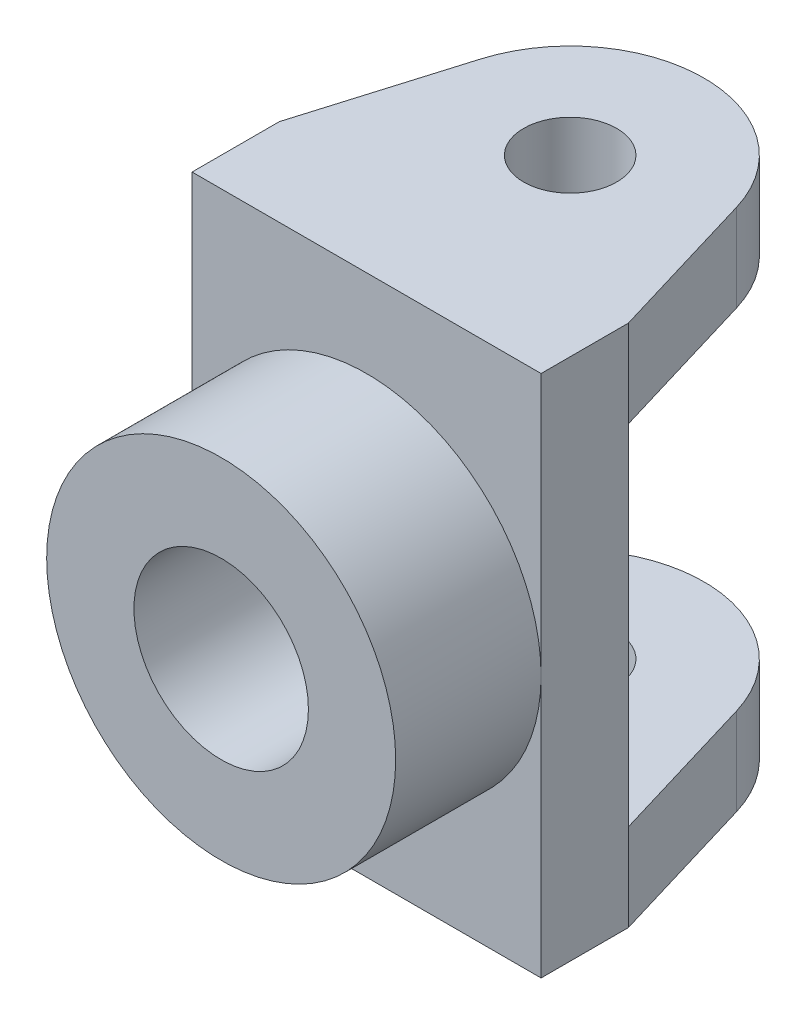
ISO-10303-21;
HEADER;
FILE_DESCRIPTION(('STEP AP214'),'2;1');
FILE_NAME('part.step','',(''),(''),'','','');
FILE_SCHEMA(('AUTOMOTIVE_DESIGN { 1 0 10303 214 1 1 1 1 }'));
ENDSEC;
DATA;
#1=APPLICATION_CONTEXT('core data for automotive mechanical design processes');
#2=APPLICATION_PROTOCOL_DEFINITION('international standard','automotive_design',2000,#1);
#3=PRODUCT_CONTEXT('',#1,'mechanical');
#4=PRODUCT('Part','Part','',(#3));
#5=PRODUCT_RELATED_PRODUCT_CATEGORY('part','',(#4));
#6=PRODUCT_DEFINITION_FORMATION('','',#4);
#7=PRODUCT_DEFINITION_CONTEXT('part definition',#1,'design');
#8=PRODUCT_DEFINITION('design','',#6,#7);
#9=PRODUCT_DEFINITION_SHAPE('','',#8);
#10=(LENGTH_UNIT() NAMED_UNIT(*) SI_UNIT(.MILLI.,.METRE.));
#11=(NAMED_UNIT(*) PLANE_ANGLE_UNIT() SI_UNIT($,.RADIAN.));
#12=(NAMED_UNIT(*) SI_UNIT($,.STERADIAN.) SOLID_ANGLE_UNIT());
#13=UNCERTAINTY_MEASURE_WITH_UNIT(LENGTH_MEASURE(1.E-05),#10,'distance_accuracy_value','');
#14=(GEOMETRIC_REPRESENTATION_CONTEXT(3) GLOBAL_UNCERTAINTY_ASSIGNED_CONTEXT((#13)) GLOBAL_UNIT_ASSIGNED_CONTEXT((#10,
#11,#12)) REPRESENTATION_CONTEXT('',''));
#15=CARTESIAN_POINT('',(0.,0.,0.));
#16=DIRECTION('',(0.,0.,1.));
#17=DIRECTION('',(1.,0.,0.));
#18=AXIS2_PLACEMENT_3D('',#15,#16,#17);
#19=CARTESIAN_POINT('',(0.,0.,0.));
#20=DIRECTION('',(0.,0.,1.));
#21=DIRECTION('',(1.,0.,0.));
#22=AXIS2_PLACEMENT_3D('',#19,#20,#21);
#23=PLANE('',#22);
#24=DIRECTION('',(1.,0.,0.));
#25=VECTOR('',#24,1.);
#26=CARTESIAN_POINT('',(-30.,-30.,0.));
#27=LINE('',#26,#25);
#28=CARTESIAN_POINT('',(-30.,-30.,0.));
#29=VERTEX_POINT('',#28);
#30=CARTESIAN_POINT('',(30.,-30.,0.));
#31=VERTEX_POINT('',#30);
#32=EDGE_CURVE('E123',#29,#31,#27,.T.);
#33=ORIENTED_EDGE('',*,*,#32,.F.);
#34=DIRECTION('',(0.,-1.,0.));
#35=VECTOR('',#34,1.);
#36=CARTESIAN_POINT('',(-30.,-45.,0.));
#37=LINE('',#36,#35);
#38=CARTESIAN_POINT('',(-30.,30.,0.));
#39=VERTEX_POINT('',#38);
#40=EDGE_CURVE('E145',#39,#29,#37,.T.);
#41=ORIENTED_EDGE('',*,*,#40,.F.);
#42=DIRECTION('',(1.,0.,0.));
#43=VECTOR('',#42,1.);
#44=CARTESIAN_POINT('',(-30.,30.,0.));
#45=LINE('',#44,#43);
#46=CARTESIAN_POINT('',(30.,30.,0.));
#47=VERTEX_POINT('',#46);
#48=EDGE_CURVE('E212',#39,#47,#45,.T.);
#49=ORIENTED_EDGE('',*,*,#48,.T.);
#50=DIRECTION('',(0.,1.,0.));
#51=VECTOR('',#50,1.);
#52=CARTESIAN_POINT('',(30.,-45.,0.));
#53=LINE('',#52,#51);
#54=EDGE_CURVE('E50',#31,#47,#53,.T.);
#55=ORIENTED_EDGE('',*,*,#54,.F.);
#56=EDGE_LOOP('',(#33,#41,#49,#55));
#57=FACE_BOUND('',#56,.T.);
#58=ADVANCED_FACE('F33',(#57),#23,.F.);
#59=CARTESIAN_POINT('',(0.,0.,15.));
#60=DIRECTION('',(0.,0.,1.));
#61=DIRECTION('',(1.,0.,0.));
#62=AXIS2_PLACEMENT_3D('',#59,#60,#61);
#63=PLANE('',#62);
#64=CARTESIAN_POINT('',(0.,0.,15.));
#65=DIRECTION('',(0.,0.,1.));
#66=DIRECTION('',(1.,0.,0.));
#67=AXIS2_PLACEMENT_3D('',#64,#65,#66);
#68=CIRCLE('',#67,30.);
#69=CARTESIAN_POINT('',(30.,0.,15.));
#70=VERTEX_POINT('',#69);
#71=CARTESIAN_POINT('',(-30.,0.,15.));
#72=VERTEX_POINT('',#71);
#73=EDGE_CURVE('E43',#70,#72,#68,.T.);
#74=ORIENTED_EDGE('',*,*,#73,.F.);
#75=DIRECTION('',(0.,1.,0.));
#76=VECTOR('',#75,1.);
#77=CARTESIAN_POINT('',(30.,-45.,15.));
#78=LINE('',#77,#76);
#79=CARTESIAN_POINT('',(30.,45.,15.));
#80=VERTEX_POINT('',#79);
#81=EDGE_CURVE('E194',#70,#80,#78,.T.);
#82=ORIENTED_EDGE('',*,*,#81,.T.);
#83=DIRECTION('',(-1.,0.,0.));
#84=VECTOR('',#83,1.);
#85=CARTESIAN_POINT('',(30.,45.,15.));
#86=LINE('',#85,#84);
#87=CARTESIAN_POINT('',(-30.,45.,15.));
#88=VERTEX_POINT('',#87);
#89=EDGE_CURVE('E157',#80,#88,#86,.T.);
#90=ORIENTED_EDGE('',*,*,#89,.T.);
#91=DIRECTION('',(0.,-1.,0.));
#92=VECTOR('',#91,1.);
#93=CARTESIAN_POINT('',(-30.,-45.,15.));
#94=LINE('',#93,#92);
#95=EDGE_CURVE('E178',#88,#72,#94,.T.);
#96=ORIENTED_EDGE('',*,*,#95,.T.);
#97=EDGE_LOOP('',(#74,#82,#90,#96));
#98=FACE_BOUND('',#97,.T.);
#99=ADVANCED_FACE('F183',(#98),#63,.T.);
#100=CARTESIAN_POINT('',(-30.,-45.,15.));
#101=DIRECTION('',(1.,0.,0.));
#102=DIRECTION('',(0.,0.,-1.));
#103=AXIS2_PLACEMENT_3D('',#100,#101,#102);
#104=PLANE('',#103);
#105=CARTESIAN_POINT('',(-30.,45.,0.));
#106=VERTEX_POINT('',#105);
#107=EDGE_CURVE('E150',#106,#39,#37,.T.);
#108=ORIENTED_EDGE('',*,*,#107,.T.);
#109=ORIENTED_EDGE('',*,*,#40,.T.);
#110=DIRECTION('',(0.,-1.,0.));
#111=VECTOR('',#110,1.);
#112=CARTESIAN_POINT('',(-30.,-30.,0.));
#113=LINE('',#112,#111);
#114=CARTESIAN_POINT('',(-30.,-45.,0.));
#115=VERTEX_POINT('',#114);
#116=EDGE_CURVE('E131',#29,#115,#113,.T.);
#117=ORIENTED_EDGE('',*,*,#116,.T.);
#118=DIRECTION('',(0.,0.,-1.));
#119=VECTOR('',#118,1.);
#120=CARTESIAN_POINT('',(-30.,-45.,15.));
#121=LINE('',#120,#119);
#122=CARTESIAN_POINT('',(-30.,-45.,15.));
#123=VERTEX_POINT('',#122);
#124=EDGE_CURVE('E37',#123,#115,#121,.T.);
#125=ORIENTED_EDGE('',*,*,#124,.F.);
#126=EDGE_CURVE('E161',#72,#123,#94,.T.);
#127=ORIENTED_EDGE('',*,*,#126,.F.);
#128=ORIENTED_EDGE('',*,*,#95,.F.);
#129=DIRECTION('',(0.,0.,-1.));
#130=VECTOR('',#129,1.);
#131=CARTESIAN_POINT('',(-30.,45.,15.));
#132=LINE('',#131,#130);
#133=EDGE_CURVE('E162',#88,#106,#132,.T.);
#134=ORIENTED_EDGE('',*,*,#133,.T.);
#135=EDGE_LOOP('',(#108,#109,#117,#125,#127,#128,#134));
#136=FACE_BOUND('',#135,.T.);
#137=ADVANCED_FACE('F35',(#136),#104,.F.);
#138=CARTESIAN_POINT('',(30.,-45.,15.));
#139=DIRECTION('',(0.,1.,0.));
#140=DIRECTION('',(-1.,0.,0.));
#141=AXIS2_PLACEMENT_3D('',#138,#139,#140);
#142=PLANE('',#141);
#143=ORIENTED_EDGE('',*,*,#124,.T.);
#144=DIRECTION('',(-0.286928155857607,0.,0.957952103905072));
#145=VECTOR('',#144,1.);
#146=CARTESIAN_POINT('',(-30.,-45.,0.));
#147=LINE('',#146,#145);
#148=CARTESIAN_POINT('',(-22.0328983898167,-45.,-26.599347584725));
#149=VERTEX_POINT('',#148);
#150=EDGE_CURVE('E134',#149,#115,#147,.T.);
#151=ORIENTED_EDGE('',*,*,#150,.F.);
#152=CARTESIAN_POINT('',(0.,-45.,-20.));
#153=DIRECTION('',(0.,1.,0.));
#154=DIRECTION('',(-1.,0.,0.));
#155=AXIS2_PLACEMENT_3D('',#152,#153,#154);
#156=CIRCLE('',#155,23.);
#157=CARTESIAN_POINT('',(22.0328983898166,-45.,-26.599347584725));
#158=VERTEX_POINT('',#157);
#159=EDGE_CURVE('E429',#158,#149,#156,.T.);
#160=ORIENTED_EDGE('',*,*,#159,.F.);
#161=DIRECTION('',(-0.286928155857607,0.,-0.957952103905071));
#162=VECTOR('',#161,1.);
#163=CARTESIAN_POINT('',(30.,-45.,0.));
#164=LINE('',#163,#162);
#165=CARTESIAN_POINT('',(30.,-45.,0.));
#166=VERTEX_POINT('',#165);
#167=EDGE_CURVE('E147',#166,#158,#164,.T.);
#168=ORIENTED_EDGE('',*,*,#167,.F.);
#169=DIRECTION('',(0.,0.,-1.));
#170=VECTOR('',#169,1.);
#171=CARTESIAN_POINT('',(30.,-45.,15.));
#172=LINE('',#171,#170);
#173=CARTESIAN_POINT('',(30.,-45.,15.));
#174=VERTEX_POINT('',#173);
#175=EDGE_CURVE('E166',#174,#166,#172,.T.);
#176=ORIENTED_EDGE('',*,*,#175,.F.);
#177=DIRECTION('',(1.,0.,0.));
#178=VECTOR('',#177,1.);
#179=CARTESIAN_POINT('',(30.,-45.,15.));
#180=LINE('',#179,#178);
#181=EDGE_CURVE('E175',#123,#174,#180,.T.);
#182=ORIENTED_EDGE('',*,*,#181,.F.);
#183=EDGE_LOOP('',(#143,#151,#160,#168,#176,#182));
#184=FACE_BOUND('',#183,.T.);
#185=CARTESIAN_POINT('',(0.,-45.,-20.));
#186=DIRECTION('',(0.,1.,0.));
#187=DIRECTION('',(-1.,0.,0.));
#188=AXIS2_PLACEMENT_3D('',#185,#186,#187);
#189=CIRCLE('',#188,8.);
#190=CARTESIAN_POINT('',(8.,-45.,-20.));
#191=VERTEX_POINT('',#190);
#192=EDGE_CURVE('E422',#191,#191,#189,.T.);
#193=ORIENTED_EDGE('',*,*,#192,.T.);
#194=EDGE_LOOP('',(#193));
#195=FACE_BOUND('',#194,.T.);
#196=ADVANCED_FACE('F172',(#184,#195),#142,.F.);
#197=CARTESIAN_POINT('',(30.,-45.,15.));
#198=DIRECTION('',(-1.,0.,0.));
#199=DIRECTION('',(0.,0.,1.));
#200=AXIS2_PLACEMENT_3D('',#197,#198,#199);
#201=PLANE('',#200);
#202=EDGE_CURVE('E159',#166,#31,#53,.T.);
#203=ORIENTED_EDGE('',*,*,#202,.T.);
#204=ORIENTED_EDGE('',*,*,#54,.T.);
#205=DIRECTION('',(0.,1.,0.));
#206=VECTOR('',#205,1.);
#207=CARTESIAN_POINT('',(30.,30.,0.));
#208=LINE('',#207,#206);
#209=CARTESIAN_POINT('',(30.,45.,0.));
#210=VERTEX_POINT('',#209);
#211=EDGE_CURVE('E200',#47,#210,#208,.T.);
#212=ORIENTED_EDGE('',*,*,#211,.T.);
#213=DIRECTION('',(0.,0.,-1.));
#214=VECTOR('',#213,1.);
#215=CARTESIAN_POINT('',(30.,45.,15.));
#216=LINE('',#215,#214);
#217=EDGE_CURVE('E164',#80,#210,#216,.T.);
#218=ORIENTED_EDGE('',*,*,#217,.F.);
#219=ORIENTED_EDGE('',*,*,#81,.F.);
#220=EDGE_CURVE('E195',#174,#70,#78,.T.);
#221=ORIENTED_EDGE('',*,*,#220,.F.);
#222=ORIENTED_EDGE('',*,*,#175,.T.);
#223=EDGE_LOOP('',(#203,#204,#212,#218,#219,#221,#222));
#224=FACE_BOUND('',#223,.T.);
#225=ADVANCED_FACE('F198',(#224),#201,.F.);
#226=CARTESIAN_POINT('',(30.,45.,15.));
#227=DIRECTION('',(0.,-1.,0.));
#228=DIRECTION('',(1.,0.,0.));
#229=AXIS2_PLACEMENT_3D('',#226,#227,#228);
#230=PLANE('',#229);
#231=ORIENTED_EDGE('',*,*,#217,.T.);
#232=DIRECTION('',(-0.286928155857607,0.,-0.957952103905071));
#233=VECTOR('',#232,1.);
#234=CARTESIAN_POINT('',(30.,45.,0.));
#235=LINE('',#234,#233);
#236=CARTESIAN_POINT('',(22.0328983898166,45.,-26.599347584725));
#237=VERTEX_POINT('',#236);
#238=EDGE_CURVE('E216',#210,#237,#235,.T.);
#239=ORIENTED_EDGE('',*,*,#238,.T.);
#240=CARTESIAN_POINT('',(0.,45.,-20.));
#241=DIRECTION('',(0.,1.,0.));
#242=DIRECTION('',(-1.,0.,0.));
#243=AXIS2_PLACEMENT_3D('',#240,#241,#242);
#244=CIRCLE('',#243,23.);
#245=CARTESIAN_POINT('',(-22.0328983898167,45.,-26.599347584725));
#246=VERTEX_POINT('',#245);
#247=EDGE_CURVE('E210',#237,#246,#244,.T.);
#248=ORIENTED_EDGE('',*,*,#247,.T.);
#249=DIRECTION('',(-0.286928155857607,0.,0.957952103905072));
#250=VECTOR('',#249,1.);
#251=CARTESIAN_POINT('',(-30.,45.,0.));
#252=LINE('',#251,#250);
#253=EDGE_CURVE('E208',#246,#106,#252,.T.);
#254=ORIENTED_EDGE('',*,*,#253,.T.);
#255=ORIENTED_EDGE('',*,*,#133,.F.);
#256=ORIENTED_EDGE('',*,*,#89,.F.);
#257=EDGE_LOOP('',(#231,#239,#248,#254,#255,#256));
#258=FACE_BOUND('',#257,.T.);
#259=CARTESIAN_POINT('',(0.,45.,-20.));
#260=DIRECTION('',(0.,1.,0.));
#261=DIRECTION('',(-1.,0.,0.));
#262=AXIS2_PLACEMENT_3D('',#259,#260,#261);
#263=CIRCLE('',#262,8.);
#264=CARTESIAN_POINT('',(-8.00000000000001,45.,-20.));
#265=VERTEX_POINT('',#264);
#266=EDGE_CURVE('E435',#265,#265,#263,.T.);
#267=ORIENTED_EDGE('',*,*,#266,.F.);
#268=EDGE_LOOP('',(#267));
#269=FACE_BOUND('',#268,.T.);
#270=ADVANCED_FACE('F203',(#258,#269),#230,.F.);
#271=EDGE_CURVE('E11',#72,#70,#68,.T.);
#272=ORIENTED_EDGE('',*,*,#271,.F.);
#273=ORIENTED_EDGE('',*,*,#126,.T.);
#274=ORIENTED_EDGE('',*,*,#181,.T.);
#275=ORIENTED_EDGE('',*,*,#220,.T.);
#276=EDGE_LOOP('',(#272,#273,#274,#275));
#277=FACE_BOUND('',#276,.T.);
#278=ADVANCED_FACE('F238',(#277),#63,.T.);
#279=CARTESIAN_POINT('',(0.,0.,40.));
#280=DIRECTION('',(0.,0.,1.));
#281=DIRECTION('',(1.,0.,0.));
#282=AXIS2_PLACEMENT_3D('',#279,#280,#281);
#283=PLANE('',#282);
#284=CARTESIAN_POINT('',(0.,0.,40.));
#285=DIRECTION('',(0.,0.,1.));
#286=DIRECTION('',(1.,0.,0.));
#287=AXIS2_PLACEMENT_3D('',#284,#285,#286);
#288=CIRCLE('',#287,30.);
#289=CARTESIAN_POINT('',(30.,0.,40.));
#290=VERTEX_POINT('',#289);
#291=EDGE_CURVE('E151',#290,#290,#288,.T.);
#292=ORIENTED_EDGE('',*,*,#291,.T.);
#293=EDGE_LOOP('',(#292));
#294=FACE_BOUND('',#293,.T.);
#295=CARTESIAN_POINT('',(0.,0.,40.));
#296=DIRECTION('',(0.,0.,1.));
#297=DIRECTION('',(1.,0.,0.));
#298=AXIS2_PLACEMENT_3D('',#295,#296,#297);
#299=CIRCLE('',#298,15.);
#300=CARTESIAN_POINT('',(15.,0.,40.));
#301=VERTEX_POINT('',#300);
#302=EDGE_CURVE('E188',#301,#301,#299,.T.);
#303=ORIENTED_EDGE('',*,*,#302,.F.);
#304=EDGE_LOOP('',(#303));
#305=FACE_BOUND('',#304,.T.);
#306=ADVANCED_FACE('F236',(#294,#305),#283,.T.);
#307=CARTESIAN_POINT('',(0.,0.,40.));
#308=DIRECTION('',(0.,0.,-1.));
#309=DIRECTION('',(-1.,0.,0.));
#310=AXIS2_PLACEMENT_3D('',#307,#308,#309);
#311=CYLINDRICAL_SURFACE('',#310,30.);
#312=ORIENTED_EDGE('',*,*,#291,.F.);
#313=EDGE_LOOP('',(#312));
#314=FACE_BOUND('',#313,.T.);
#315=ORIENTED_EDGE('',*,*,#73,.T.);
#316=ORIENTED_EDGE('',*,*,#271,.T.);
#317=EDGE_LOOP('',(#315,#316));
#318=FACE_BOUND('',#317,.T.);
#319=ADVANCED_FACE('F187',(#314,#318),#311,.T.);
#320=CARTESIAN_POINT('',(0.,0.,40.));
#321=DIRECTION('',(0.,0.,-1.));
#322=DIRECTION('',(-1.,0.,0.));
#323=AXIS2_PLACEMENT_3D('',#320,#321,#322);
#324=CYLINDRICAL_SURFACE('',#323,15.);
#325=CARTESIAN_POINT('',(0.,0.,15.));
#326=DIRECTION('',(0.,0.,1.));
#327=DIRECTION('',(1.,0.,0.));
#328=AXIS2_PLACEMENT_3D('',#325,#326,#327);
#329=CIRCLE('',#328,15.);
#330=CARTESIAN_POINT('',(15.,0.,15.));
#331=VERTEX_POINT('',#330);
#332=EDGE_CURVE('E190',#331,#331,#329,.T.);
#333=ORIENTED_EDGE('',*,*,#332,.F.);
#334=EDGE_LOOP('',(#333));
#335=FACE_BOUND('',#334,.T.);
#336=ORIENTED_EDGE('',*,*,#302,.T.);
#337=EDGE_LOOP('',(#336));
#338=FACE_BOUND('',#337,.T.);
#339=ADVANCED_FACE('F230',(#335,#338),#324,.F.);
#340=ORIENTED_EDGE('',*,*,#332,.T.);
#341=EDGE_LOOP('',(#340));
#342=FACE_BOUND('',#341,.T.);
#343=ADVANCED_FACE('F228',(#342),#63,.T.);
#344=CARTESIAN_POINT('',(-30.,30.,0.));
#345=DIRECTION('',(-0.957952103905072,0.,-0.286928155857607));
#346=DIRECTION('',(-0.286928155857607,0.,0.957952103905072));
#347=AXIS2_PLACEMENT_3D('',#344,#345,#346);
#348=PLANE('',#347);
#349=ORIENTED_EDGE('',*,*,#253,.F.);
#350=DIRECTION('',(0.,1.,0.));
#351=VECTOR('',#350,1.);
#352=CARTESIAN_POINT('',(-22.0328983898167,30.,-26.599347584725));
#353=LINE('',#352,#351);
#354=CARTESIAN_POINT('',(-22.0328983898167,30.,-26.599347584725));
#355=VERTEX_POINT('',#354);
#356=EDGE_CURVE('E220',#355,#246,#353,.T.);
#357=ORIENTED_EDGE('',*,*,#356,.F.);
#358=DIRECTION('',(-0.286928155857607,0.,0.957952103905072));
#359=VECTOR('',#358,1.);
#360=CARTESIAN_POINT('',(-30.,30.,0.));
#361=LINE('',#360,#359);
#362=EDGE_CURVE('E224',#355,#39,#361,.T.);
#363=ORIENTED_EDGE('',*,*,#362,.T.);
#364=ORIENTED_EDGE('',*,*,#107,.F.);
#365=EDGE_LOOP('',(#349,#357,#363,#364));
#366=FACE_BOUND('',#365,.T.);
#367=ADVANCED_FACE('F301',(#366),#348,.T.);
#368=CARTESIAN_POINT('',(0.,30.,-20.));
#369=DIRECTION('',(0.,1.,0.));
#370=DIRECTION('',(-1.,0.,0.));
#371=AXIS2_PLACEMENT_3D('',#368,#369,#370);
#372=CYLINDRICAL_SURFACE('',#371,23.);
#373=ORIENTED_EDGE('',*,*,#247,.F.);
#374=DIRECTION('',(0.,1.,0.));
#375=VECTOR('',#374,1.);
#376=CARTESIAN_POINT('',(22.0328983898166,30.,-26.599347584725));
#377=LINE('',#376,#375);
#378=CARTESIAN_POINT('',(22.0328983898166,30.,-26.599347584725));
#379=VERTEX_POINT('',#378);
#380=EDGE_CURVE('E222',#379,#237,#377,.T.);
#381=ORIENTED_EDGE('',*,*,#380,.F.);
#382=CARTESIAN_POINT('',(0.,30.,-20.));
#383=DIRECTION('',(0.,1.,0.));
#384=DIRECTION('',(-1.,0.,0.));
#385=AXIS2_PLACEMENT_3D('',#382,#383,#384);
#386=CIRCLE('',#385,23.);
#387=EDGE_CURVE('E444',#379,#355,#386,.T.);
#388=ORIENTED_EDGE('',*,*,#387,.T.);
#389=ORIENTED_EDGE('',*,*,#356,.T.);
#390=EDGE_LOOP('',(#373,#381,#388,#389));
#391=FACE_BOUND('',#390,.T.);
#392=ADVANCED_FACE('F314',(#391),#372,.T.);
#393=CARTESIAN_POINT('',(30.,30.,0.));
#394=DIRECTION('',(0.957952103905071,0.,-0.286928155857607));
#395=DIRECTION('',(-0.286928155857607,0.,-0.957952103905071));
#396=AXIS2_PLACEMENT_3D('',#393,#394,#395);
#397=PLANE('',#396);
#398=ORIENTED_EDGE('',*,*,#238,.F.);
#399=ORIENTED_EDGE('',*,*,#211,.F.);
#400=DIRECTION('',(-0.286928155857607,0.,-0.957952103905071));
#401=VECTOR('',#400,1.);
#402=CARTESIAN_POINT('',(30.,30.,0.));
#403=LINE('',#402,#401);
#404=EDGE_CURVE('E214',#47,#379,#403,.T.);
#405=ORIENTED_EDGE('',*,*,#404,.T.);
#406=ORIENTED_EDGE('',*,*,#380,.T.);
#407=EDGE_LOOP('',(#398,#399,#405,#406));
#408=FACE_BOUND('',#407,.T.);
#409=ADVANCED_FACE('F323',(#408),#397,.T.);
#410=CARTESIAN_POINT('',(0.,30.,-20.));
#411=DIRECTION('',(0.,1.,0.));
#412=DIRECTION('',(-1.,0.,0.));
#413=AXIS2_PLACEMENT_3D('',#410,#411,#412);
#414=PLANE('',#413);
#415=CARTESIAN_POINT('',(0.,30.,-20.));
#416=DIRECTION('',(0.,1.,0.));
#417=DIRECTION('',(-1.,0.,0.));
#418=AXIS2_PLACEMENT_3D('',#415,#416,#417);
#419=CIRCLE('',#418,8.);
#420=CARTESIAN_POINT('',(-8.00000000000001,30.,-20.));
#421=VERTEX_POINT('',#420);
#422=EDGE_CURVE('E437',#421,#421,#419,.T.);
#423=ORIENTED_EDGE('',*,*,#422,.T.);
#424=EDGE_LOOP('',(#423));
#425=FACE_BOUND('',#424,.T.);
#426=ORIENTED_EDGE('',*,*,#48,.F.);
#427=ORIENTED_EDGE('',*,*,#362,.F.);
#428=ORIENTED_EDGE('',*,*,#387,.F.);
#429=ORIENTED_EDGE('',*,*,#404,.F.);
#430=EDGE_LOOP('',(#426,#427,#428,#429));
#431=FACE_BOUND('',#430,.T.);
#432=ADVANCED_FACE('F333',(#425,#431),#414,.F.);
#433=CARTESIAN_POINT('',(0.,30.,-20.));
#434=DIRECTION('',(0.,1.,0.));
#435=DIRECTION('',(-1.,0.,0.));
#436=AXIS2_PLACEMENT_3D('',#433,#434,#435);
#437=CYLINDRICAL_SURFACE('',#436,8.);
#438=CARTESIAN_POINT('',(-8.00000000000001,30.,-20.));
#439=CARTESIAN_POINT('',(-8.00000000000001,30.15625,-20.));
#440=CARTESIAN_POINT('',(-8.00000000000001,30.3125,-20.));
#441=CARTESIAN_POINT('',(-8.00000000000001,30.625,-20.));
#442=CARTESIAN_POINT('',(-8.00000000000001,30.78125,-20.));
#443=CARTESIAN_POINT('',(-8.00000000000001,31.09375,-20.));
#444=CARTESIAN_POINT('',(-8.00000000000001,31.25,-20.));
#445=CARTESIAN_POINT('',(-8.00000000000001,31.5625,-20.));
#446=CARTESIAN_POINT('',(-8.00000000000001,31.71875,-20.));
#447=CARTESIAN_POINT('',(-8.00000000000001,32.03125,-20.));
#448=CARTESIAN_POINT('',(-8.00000000000001,32.1875,-20.));
#449=CARTESIAN_POINT('',(-8.00000000000001,32.5,-20.));
#450=CARTESIAN_POINT('',(-8.00000000000001,32.65625,-20.));
#451=CARTESIAN_POINT('',(-8.00000000000001,32.96875,-20.));
#452=CARTESIAN_POINT('',(-8.00000000000001,33.125,-20.));
#453=CARTESIAN_POINT('',(-8.00000000000001,33.4375,-20.));
#454=CARTESIAN_POINT('',(-8.00000000000001,33.59375,-20.));
#455=CARTESIAN_POINT('',(-8.00000000000001,33.90625,-20.));
#456=CARTESIAN_POINT('',(-8.00000000000001,34.0625,-20.));
#457=CARTESIAN_POINT('',(-8.00000000000001,34.375,-20.));
#458=CARTESIAN_POINT('',(-8.00000000000001,34.53125,-20.));
#459=CARTESIAN_POINT('',(-8.00000000000001,34.84375,-20.));
#460=CARTESIAN_POINT('',(-8.00000000000001,35.,-20.));
#461=CARTESIAN_POINT('',(-8.00000000000001,35.3125,-20.));
#462=CARTESIAN_POINT('',(-8.00000000000001,35.46875,-20.));
#463=CARTESIAN_POINT('',(-8.00000000000001,35.78125,-20.));
#464=CARTESIAN_POINT('',(-8.00000000000001,35.9375,-20.));
#465=CARTESIAN_POINT('',(-8.00000000000001,36.25,-20.));
#466=CARTESIAN_POINT('',(-8.00000000000001,36.40625,-20.));
#467=CARTESIAN_POINT('',(-8.00000000000001,36.71875,-20.));
#468=CARTESIAN_POINT('',(-8.00000000000001,36.875,-20.));
#469=CARTESIAN_POINT('',(-8.00000000000001,37.1875,-20.));
#470=CARTESIAN_POINT('',(-8.00000000000001,37.34375,-20.));
#471=CARTESIAN_POINT('',(-8.00000000000001,37.65625,-20.));
#472=CARTESIAN_POINT('',(-8.00000000000001,37.8125,-20.));
#473=CARTESIAN_POINT('',(-8.00000000000001,38.125,-20.));
#474=CARTESIAN_POINT('',(-8.00000000000001,38.28125,-20.));
#475=CARTESIAN_POINT('',(-8.00000000000001,38.59375,-20.));
#476=CARTESIAN_POINT('',(-8.00000000000001,38.75,-20.));
#477=CARTESIAN_POINT('',(-8.00000000000001,39.0625,-20.));
#478=CARTESIAN_POINT('',(-8.00000000000001,39.21875,-20.));
#479=CARTESIAN_POINT('',(-8.00000000000001,39.53125,-20.));
#480=CARTESIAN_POINT('',(-8.00000000000001,39.6875,-20.));
#481=CARTESIAN_POINT('',(-8.00000000000001,40.,-20.));
#482=CARTESIAN_POINT('',(-8.00000000000001,40.15625,-20.));
#483=CARTESIAN_POINT('',(-8.00000000000001,40.46875,-20.));
#484=CARTESIAN_POINT('',(-8.00000000000001,40.625,-20.));
#485=CARTESIAN_POINT('',(-8.00000000000001,40.9375,-20.));
#486=CARTESIAN_POINT('',(-8.00000000000001,41.09375,-20.));
#487=CARTESIAN_POINT('',(-8.00000000000001,41.40625,-20.));
#488=CARTESIAN_POINT('',(-8.00000000000001,41.5625,-20.));
#489=CARTESIAN_POINT('',(-8.00000000000001,41.875,-20.));
#490=CARTESIAN_POINT('',(-8.00000000000001,42.03125,-20.));
#491=CARTESIAN_POINT('',(-8.00000000000001,42.34375,-20.));
#492=CARTESIAN_POINT('',(-8.00000000000001,42.5,-20.));
#493=CARTESIAN_POINT('',(-8.00000000000001,42.8125,-20.));
#494=CARTESIAN_POINT('',(-8.00000000000001,42.96875,-20.));
#495=CARTESIAN_POINT('',(-8.00000000000001,43.28125,-20.));
#496=CARTESIAN_POINT('',(-8.00000000000001,43.4375,-20.));
#497=CARTESIAN_POINT('',(-8.00000000000001,43.75,-20.));
#498=CARTESIAN_POINT('',(-8.00000000000001,43.90625,-20.));
#499=CARTESIAN_POINT('',(-8.00000000000001,44.21875,-20.));
#500=CARTESIAN_POINT('',(-8.00000000000001,44.375,-20.));
#501=CARTESIAN_POINT('',(-8.00000000000001,44.6875,-20.));
#502=CARTESIAN_POINT('',(-8.00000000000001,44.84375,-20.));
#503=CARTESIAN_POINT('',(-8.00000000000001,45.,-20.));
#504=B_SPLINE_CURVE_WITH_KNOTS('',3,(#438,#439,#440,#441,#442,#443,#444,#445,#446,#447,#448,
#449,#450,#451,#452,#453,#454,#455,#456,#457,#458,#459,#460,#461,#462,#463,#464,#465,#466,#467,
#468,#469,#470,#471,#472,#473,#474,#475,#476,#477,#478,#479,#480,#481,#482,#483,#484,#485,#486,
#487,#488,#489,#490,#491,#492,#493,#494,#495,#496,#497,#498,#499,#500,#501,#502,#503),
.UNSPECIFIED.,.F.,.F.,(4,2,2,2,2,2,2,2,2,2,2,2,2,2,2,2,2,2,2,2,2,2,2,2,2,2,2,2,2,2,2,2,4),(0.,
0.46875,0.937500000000001,1.40625,1.875,2.34375,2.8125,3.28125,3.75,4.21875,4.6875,5.15625,
5.625,6.09375,6.5625,7.03125,7.5,7.96875,8.4375,8.90625,9.37500000000001,9.84375,10.3125,
10.78125,11.25,11.71875,12.1875,12.65625,13.125,13.59375,14.0625,14.53125,15.),.UNSPECIFIED.);
#505=EDGE_CURVE('BSEAM343',#421,#265,#504,.T.);
#506=ORIENTED_EDGE('',*,*,#422,.F.);
#507=ORIENTED_EDGE('',*,*,#266,.T.);
#508=ORIENTED_EDGE('',*,*,#505,.T.);
#509=ORIENTED_EDGE('',*,*,#505,.F.);
#510=EDGE_LOOP('',(#506,#508,#507,#509));
#511=FACE_BOUND('',#510,.T.);
#512=ADVANCED_FACE('F343',(#511),#437,.F.);
#513=CARTESIAN_POINT('',(0.,-30.,-20.));
#514=DIRECTION('',(0.,-1.,0.));
#515=DIRECTION('',(-1.,0.,0.));
#516=AXIS2_PLACEMENT_3D('',#513,#514,#515);
#517=PLANE('',#516);
#518=ORIENTED_EDGE('',*,*,#32,.T.);
#519=DIRECTION('',(-0.286928155857607,0.,-0.957952103905071));
#520=VECTOR('',#519,1.);
#521=CARTESIAN_POINT('',(30.,-30.,0.));
#522=LINE('',#521,#520);
#523=CARTESIAN_POINT('',(22.0328983898166,-30.,-26.599347584725));
#524=VERTEX_POINT('',#523);
#525=EDGE_CURVE('E140',#31,#524,#522,.T.);
#526=ORIENTED_EDGE('',*,*,#525,.T.);
#527=CARTESIAN_POINT('',(0.,-30.,-20.));
#528=DIRECTION('',(0.,1.,0.));
#529=DIRECTION('',(-1.,0.,0.));
#530=AXIS2_PLACEMENT_3D('',#527,#528,#529);
#531=CIRCLE('',#530,23.);
#532=CARTESIAN_POINT('',(-22.0328983898167,-30.,-26.599347584725));
#533=VERTEX_POINT('',#532);
#534=EDGE_CURVE('E125',#524,#533,#531,.T.);
#535=ORIENTED_EDGE('',*,*,#534,.T.);
#536=DIRECTION('',(-0.286928155857607,0.,0.957952103905072));
#537=VECTOR('',#536,1.);
#538=CARTESIAN_POINT('',(-30.,-30.,0.));
#539=LINE('',#538,#537);
#540=EDGE_CURVE('E118',#533,#29,#539,.T.);
#541=ORIENTED_EDGE('',*,*,#540,.T.);
#542=EDGE_LOOP('',(#518,#526,#535,#541));
#543=FACE_BOUND('',#542,.T.);
#544=CARTESIAN_POINT('',(0.,-30.,-20.));
#545=DIRECTION('',(0.,1.,0.));
#546=DIRECTION('',(-1.,0.,0.));
#547=AXIS2_PLACEMENT_3D('',#544,#545,#546);
#548=CIRCLE('',#547,8.);
#549=CARTESIAN_POINT('',(8.,-30.,-20.));
#550=VERTEX_POINT('',#549);
#551=EDGE_CURVE('E419',#550,#550,#548,.T.);
#552=ORIENTED_EDGE('',*,*,#551,.F.);
#553=EDGE_LOOP('',(#552));
#554=FACE_BOUND('',#553,.T.);
#555=ADVANCED_FACE('F120',(#543,#554),#517,.F.);
#556=CARTESIAN_POINT('',(30.,-30.,0.));
#557=DIRECTION('',(-0.957952103905071,0.,0.286928155857607));
#558=DIRECTION('',(0.286928155857607,0.,0.957952103905071));
#559=AXIS2_PLACEMENT_3D('',#556,#557,#558);
#560=PLANE('',#559);
#561=ORIENTED_EDGE('',*,*,#167,.T.);
#562=DIRECTION('',(0.,-1.,0.));
#563=VECTOR('',#562,1.);
#564=CARTESIAN_POINT('',(22.0328983898166,-30.,-26.599347584725));
#565=LINE('',#564,#563);
#566=EDGE_CURVE('E432',#524,#158,#565,.T.);
#567=ORIENTED_EDGE('',*,*,#566,.F.);
#568=ORIENTED_EDGE('',*,*,#525,.F.);
#569=ORIENTED_EDGE('',*,*,#202,.F.);
#570=EDGE_LOOP('',(#561,#567,#568,#569));
#571=FACE_BOUND('',#570,.T.);
#572=ADVANCED_FACE('F376',(#571),#560,.F.);
#573=CARTESIAN_POINT('',(0.,-30.,-20.));
#574=DIRECTION('',(0.,-1.,0.));
#575=DIRECTION('',(1.,0.,0.));
#576=AXIS2_PLACEMENT_3D('',#573,#574,#575);
#577=CYLINDRICAL_SURFACE('',#576,23.);
#578=ORIENTED_EDGE('',*,*,#159,.T.);
#579=DIRECTION('',(0.,-1.,0.));
#580=VECTOR('',#579,1.);
#581=CARTESIAN_POINT('',(-22.0328983898167,-30.,-26.599347584725));
#582=LINE('',#581,#580);
#583=EDGE_CURVE('E139',#533,#149,#582,.T.);
#584=ORIENTED_EDGE('',*,*,#583,.F.);
#585=ORIENTED_EDGE('',*,*,#534,.F.);
#586=ORIENTED_EDGE('',*,*,#566,.T.);
#587=EDGE_LOOP('',(#578,#584,#585,#586));
#588=FACE_BOUND('',#587,.T.);
#589=ADVANCED_FACE('F384',(#588),#577,.T.);
#590=CARTESIAN_POINT('',(-30.,-30.,0.));
#591=DIRECTION('',(0.957952103905072,0.,0.286928155857607));
#592=DIRECTION('',(0.286928155857607,0.,-0.957952103905072));
#593=AXIS2_PLACEMENT_3D('',#590,#591,#592);
#594=PLANE('',#593);
#595=ORIENTED_EDGE('',*,*,#150,.T.);
#596=ORIENTED_EDGE('',*,*,#116,.F.);
#597=ORIENTED_EDGE('',*,*,#540,.F.);
#598=ORIENTED_EDGE('',*,*,#583,.T.);
#599=EDGE_LOOP('',(#595,#596,#597,#598));
#600=FACE_BOUND('',#599,.T.);
#601=ADVANCED_FACE('F132',(#600),#594,.F.);
#602=CARTESIAN_POINT('',(0.,-30.,-20.));
#603=DIRECTION('',(0.,-1.,0.));
#604=DIRECTION('',(1.,0.,0.));
#605=AXIS2_PLACEMENT_3D('',#602,#603,#604);
#606=CYLINDRICAL_SURFACE('',#605,8.);
#607=CARTESIAN_POINT('',(8.,-30.,-20.));
#608=CARTESIAN_POINT('',(8.,-30.15625,-20.));
#609=CARTESIAN_POINT('',(8.,-30.3125,-20.));
#610=CARTESIAN_POINT('',(8.,-30.625,-20.));
#611=CARTESIAN_POINT('',(8.,-30.78125,-20.));
#612=CARTESIAN_POINT('',(8.,-31.09375,-20.));
#613=CARTESIAN_POINT('',(8.,-31.25,-20.));
#614=CARTESIAN_POINT('',(8.,-31.5625,-20.));
#615=CARTESIAN_POINT('',(8.,-31.71875,-20.));
#616=CARTESIAN_POINT('',(8.,-32.03125,-20.));
#617=CARTESIAN_POINT('',(8.,-32.1875,-20.));
#618=CARTESIAN_POINT('',(8.,-32.5,-20.));
#619=CARTESIAN_POINT('',(8.,-32.65625,-20.));
#620=CARTESIAN_POINT('',(8.,-32.96875,-20.));
#621=CARTESIAN_POINT('',(8.,-33.125,-20.));
#622=CARTESIAN_POINT('',(8.,-33.4375,-20.));
#623=CARTESIAN_POINT('',(8.,-33.59375,-20.));
#624=CARTESIAN_POINT('',(8.,-33.90625,-20.));
#625=CARTESIAN_POINT('',(8.,-34.0625,-20.));
#626=CARTESIAN_POINT('',(8.,-34.375,-20.));
#627=CARTESIAN_POINT('',(8.,-34.53125,-20.));
#628=CARTESIAN_POINT('',(8.,-34.84375,-20.));
#629=CARTESIAN_POINT('',(8.,-35.,-20.));
#630=CARTESIAN_POINT('',(8.,-35.3125,-20.));
#631=CARTESIAN_POINT('',(8.,-35.46875,-20.));
#632=CARTESIAN_POINT('',(8.,-35.78125,-20.));
#633=CARTESIAN_POINT('',(8.,-35.9375,-20.));
#634=CARTESIAN_POINT('',(8.,-36.25,-20.));
#635=CARTESIAN_POINT('',(8.,-36.40625,-20.));
#636=CARTESIAN_POINT('',(8.,-36.71875,-20.));
#637=CARTESIAN_POINT('',(8.,-36.875,-20.));
#638=CARTESIAN_POINT('',(8.,-37.1875,-20.));
#639=CARTESIAN_POINT('',(8.,-37.34375,-20.));
#640=CARTESIAN_POINT('',(8.,-37.65625,-20.));
#641=CARTESIAN_POINT('',(8.,-37.8125,-20.));
#642=CARTESIAN_POINT('',(8.,-38.125,-20.));
#643=CARTESIAN_POINT('',(8.,-38.28125,-20.));
#644=CARTESIAN_POINT('',(8.,-38.59375,-20.));
#645=CARTESIAN_POINT('',(8.,-38.75,-20.));
#646=CARTESIAN_POINT('',(8.,-39.0625,-20.));
#647=CARTESIAN_POINT('',(8.,-39.21875,-20.));
#648=CARTESIAN_POINT('',(8.,-39.53125,-20.));
#649=CARTESIAN_POINT('',(8.,-39.6875,-20.));
#650=CARTESIAN_POINT('',(8.,-40.,-20.));
#651=CARTESIAN_POINT('',(8.,-40.15625,-20.));
#652=CARTESIAN_POINT('',(8.,-40.46875,-20.));
#653=CARTESIAN_POINT('',(8.,-40.625,-20.));
#654=CARTESIAN_POINT('',(8.,-40.9375,-20.));
#655=CARTESIAN_POINT('',(8.,-41.09375,-20.));
#656=CARTESIAN_POINT('',(8.,-41.40625,-20.));
#657=CARTESIAN_POINT('',(8.,-41.5625,-20.));
#658=CARTESIAN_POINT('',(8.,-41.875,-20.));
#659=CARTESIAN_POINT('',(8.,-42.03125,-20.));
#660=CARTESIAN_POINT('',(8.,-42.34375,-20.));
#661=CARTESIAN_POINT('',(8.,-42.5,-20.));
#662=CARTESIAN_POINT('',(8.,-42.8125,-20.));
#663=CARTESIAN_POINT('',(8.,-42.96875,-20.));
#664=CARTESIAN_POINT('',(8.,-43.28125,-20.));
#665=CARTESIAN_POINT('',(8.,-43.4375,-20.));
#666=CARTESIAN_POINT('',(8.,-43.75,-20.));
#667=CARTESIAN_POINT('',(8.,-43.90625,-20.));
#668=CARTESIAN_POINT('',(8.,-44.21875,-20.));
#669=CARTESIAN_POINT('',(8.,-44.375,-20.));
#670=CARTESIAN_POINT('',(8.,-44.6875,-20.));
#671=CARTESIAN_POINT('',(8.,-44.84375,-20.));
#672=CARTESIAN_POINT('',(8.,-45.,-20.));
#673=B_SPLINE_CURVE_WITH_KNOTS('',3,(#607,#608,#609,#610,#611,#612,#613,#614,#615,#616,#617,
#618,#619,#620,#621,#622,#623,#624,#625,#626,#627,#628,#629,#630,#631,#632,#633,#634,#635,#636,
#637,#638,#639,#640,#641,#642,#643,#644,#645,#646,#647,#648,#649,#650,#651,#652,#653,#654,#655,
#656,#657,#658,#659,#660,#661,#662,#663,#664,#665,#666,#667,#668,#669,#670,#671,#672),
.UNSPECIFIED.,.F.,.F.,(4,2,2,2,2,2,2,2,2,2,2,2,2,2,2,2,2,2,2,2,2,2,2,2,2,2,2,2,2,2,2,2,4),(0.,
0.468749999999997,0.937499999999997,1.40625,1.875,2.34375,2.8125,3.28125,3.75,4.21875,4.6875,
5.15625,5.62499999999999,6.09375,6.5625,7.03125,7.5,7.96875,8.4375,8.90624999999999,9.375,
9.84374999999999,10.3125,10.78125,11.25,11.71875,12.1875,12.65625,13.125,13.59375,14.0625,
14.53125,15.),.UNSPECIFIED.);
#674=EDGE_CURVE('BSEAM401',#550,#191,#673,.T.);
#675=ORIENTED_EDGE('',*,*,#551,.T.);
#676=ORIENTED_EDGE('',*,*,#192,.F.);
#677=ORIENTED_EDGE('',*,*,#674,.T.);
#678=ORIENTED_EDGE('',*,*,#674,.F.);
#679=EDGE_LOOP('',(#675,#677,#676,#678));
#680=FACE_BOUND('',#679,.T.);
#681=ADVANCED_FACE('F401',(#680),#606,.F.);
#682=CLOSED_SHELL('',(#58,#99,#137,#196,#225,#270,#278,#306,#319,#339,#343,#367,#392,#409,#432,
#512,#555,#572,#589,#601,#681));
#683=MANIFOLD_SOLID_BREP('B2',#682);
#684=ADVANCED_BREP_SHAPE_REPRESENTATION('',(#18,#683),#14);
#685=SHAPE_DEFINITION_REPRESENTATION(#9,#684);
ENDSEC;
END-ISO-10303-21;
